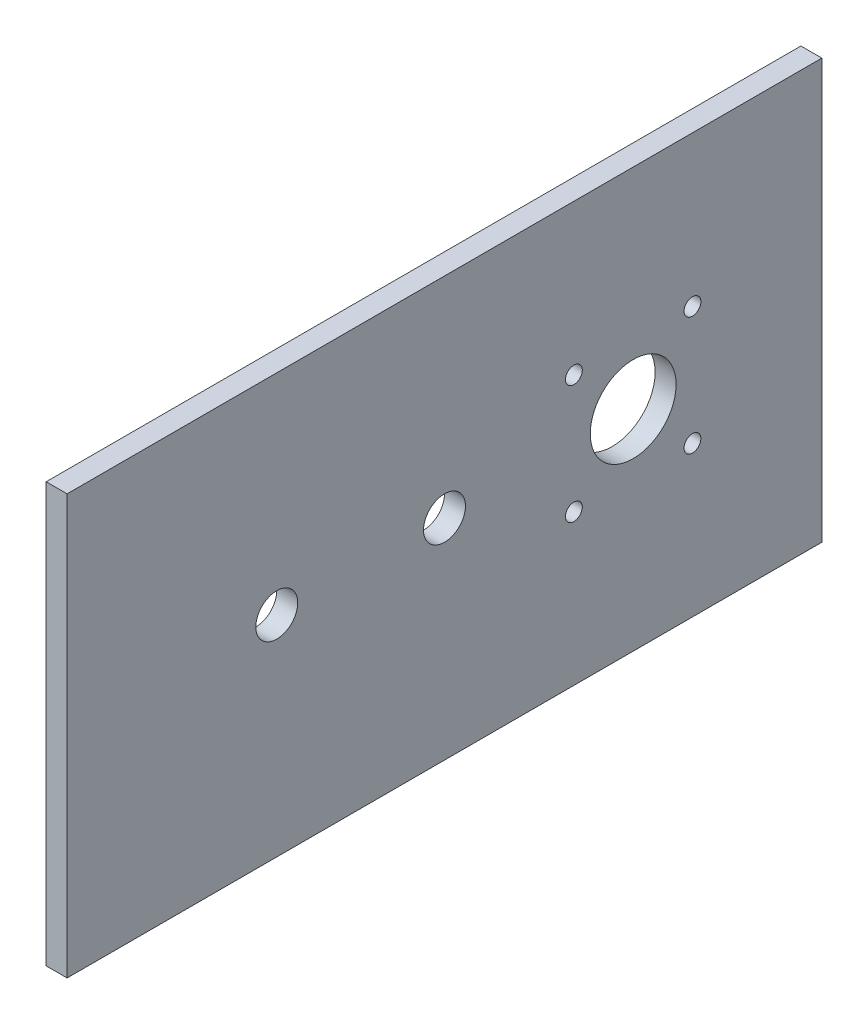
ISO-10303-21;
HEADER;
FILE_DESCRIPTION(('STEP AP214'),'2;1');
FILE_NAME('part.step','',(''),(''),'','','');
FILE_SCHEMA(('AUTOMOTIVE_DESIGN { 1 0 10303 214 1 1 1 1 }'));
ENDSEC;
DATA;
#1=APPLICATION_CONTEXT('core data for automotive mechanical design processes');
#2=APPLICATION_PROTOCOL_DEFINITION('international standard','automotive_design',2000,#1);
#3=PRODUCT_CONTEXT('',#1,'mechanical');
#4=PRODUCT('Part','Part','',(#3));
#5=PRODUCT_RELATED_PRODUCT_CATEGORY('part','',(#4));
#6=PRODUCT_DEFINITION_FORMATION('','',#4);
#7=PRODUCT_DEFINITION_CONTEXT('part definition',#1,'design');
#8=PRODUCT_DEFINITION('design','',#6,#7);
#9=PRODUCT_DEFINITION_SHAPE('','',#8);
#10=(LENGTH_UNIT() NAMED_UNIT(*) SI_UNIT(.MILLI.,.METRE.));
#11=(NAMED_UNIT(*) PLANE_ANGLE_UNIT() SI_UNIT($,.RADIAN.));
#12=(NAMED_UNIT(*) SI_UNIT($,.STERADIAN.) SOLID_ANGLE_UNIT());
#13=UNCERTAINTY_MEASURE_WITH_UNIT(LENGTH_MEASURE(1.E-05),#10,'distance_accuracy_value','');
#14=(GEOMETRIC_REPRESENTATION_CONTEXT(3) GLOBAL_UNCERTAINTY_ASSIGNED_CONTEXT((#13)) GLOBAL_UNIT_ASSIGNED_CONTEXT((#10,
#11,#12)) REPRESENTATION_CONTEXT('',''));
#15=CARTESIAN_POINT('',(0.,0.,0.));
#16=DIRECTION('',(0.,0.,1.));
#17=DIRECTION('',(1.,0.,0.));
#18=AXIS2_PLACEMENT_3D('',#15,#16,#17);
#19=CARTESIAN_POINT('',(6.35,0.,0.));
#20=DIRECTION('',(1.,0.,0.));
#21=DIRECTION('',(0.,0.,-1.));
#22=AXIS2_PLACEMENT_3D('',#19,#20,#21);
#23=PLANE('',#22);
#24=CARTESIAN_POINT('',(6.35,-17.9605122421383,-39.1894877578617));
#25=DIRECTION('',(1.,0.,0.));
#26=DIRECTION('',(0.,0.,-1.));
#27=AXIS2_PLACEMENT_3D('',#24,#25,#26);
#28=CIRCLE('',#27,2.5527);
#29=CARTESIAN_POINT('',(6.35,-17.9605122421383,-41.7421877578617));
#30=VERTEX_POINT('',#29);
#31=EDGE_CURVE('E166',#30,#30,#28,.T.);
#32=ORIENTED_EDGE('',*,*,#31,.F.);
#33=EDGE_LOOP('',(#32));
#34=FACE_BOUND('',#33,.T.);
#35=CARTESIAN_POINT('',(6.35,17.9605122421383,-75.1105122421383));
#36=DIRECTION('',(1.,0.,0.));
#37=DIRECTION('',(0.,0.,-1.));
#38=AXIS2_PLACEMENT_3D('',#35,#36,#37);
#39=CIRCLE('',#38,2.55270000000001);
#40=CARTESIAN_POINT('',(6.35,17.9605122421383,-77.6632122421383));
#41=VERTEX_POINT('',#40);
#42=EDGE_CURVE('E150',#41,#41,#39,.T.);
#43=ORIENTED_EDGE('',*,*,#42,.F.);
#44=EDGE_LOOP('',(#43));
#45=FACE_BOUND('',#44,.T.);
#46=CARTESIAN_POINT('',(6.35,0.,-57.15));
#47=DIRECTION('',(1.,0.,0.));
#48=DIRECTION('',(0.,0.,-1.));
#49=AXIS2_PLACEMENT_3D('',#46,#47,#48);
#50=CIRCLE('',#49,13.000000035);
#51=CARTESIAN_POINT('',(6.35,0.,-70.150000035));
#52=VERTEX_POINT('',#51);
#53=EDGE_CURVE('E134',#52,#52,#50,.T.);
#54=ORIENTED_EDGE('',*,*,#53,.F.);
#55=EDGE_LOOP('',(#54));
#56=FACE_BOUND('',#55,.T.);
#57=DIRECTION('',(0.,-1.,0.));
#58=VECTOR('',#57,1.);
#59=CARTESIAN_POINT('',(6.35,-63.5,114.3));
#60=LINE('',#59,#58);
#61=CARTESIAN_POINT('',(6.35,63.5,114.3));
#62=VERTEX_POINT('',#61);
#63=CARTESIAN_POINT('',(6.35,-63.5,114.3));
#64=VERTEX_POINT('',#63);
#65=EDGE_CURVE('E92',#62,#64,#60,.T.);
#66=ORIENTED_EDGE('',*,*,#65,.T.);
#67=DIRECTION('',(0.,0.,-1.));
#68=VECTOR('',#67,1.);
#69=CARTESIAN_POINT('',(6.35,-63.5,-114.3));
#70=LINE('',#69,#68);
#71=CARTESIAN_POINT('',(6.35,-63.5,-114.3));
#72=VERTEX_POINT('',#71);
#73=EDGE_CURVE('E87',#64,#72,#70,.T.);
#74=ORIENTED_EDGE('',*,*,#73,.T.);
#75=DIRECTION('',(0.,1.,0.));
#76=VECTOR('',#75,1.);
#77=CARTESIAN_POINT('',(6.35,-63.5,-114.3));
#78=LINE('',#77,#76);
#79=CARTESIAN_POINT('',(6.35,63.5,-114.3));
#80=VERTEX_POINT('',#79);
#81=EDGE_CURVE('E90',#72,#80,#78,.T.);
#82=ORIENTED_EDGE('',*,*,#81,.T.);
#83=DIRECTION('',(0.,0.,1.));
#84=VECTOR('',#83,1.);
#85=CARTESIAN_POINT('',(6.35,63.5,-114.3));
#86=LINE('',#85,#84);
#87=EDGE_CURVE('E57',#80,#62,#86,.T.);
#88=ORIENTED_EDGE('',*,*,#87,.T.);
#89=EDGE_LOOP('',(#66,#74,#82,#88));
#90=FACE_BOUND('',#89,.T.);
#91=CARTESIAN_POINT('',(6.35,0.,50.8));
#92=DIRECTION('',(1.,0.,0.));
#93=DIRECTION('',(0.,0.,-1.));
#94=AXIS2_PLACEMENT_3D('',#91,#92,#93);
#95=CIRCLE('',#94,6.35);
#96=CARTESIAN_POINT('',(6.35,0.,44.45));
#97=VERTEX_POINT('',#96);
#98=EDGE_CURVE('E112',#97,#97,#95,.T.);
#99=ORIENTED_EDGE('',*,*,#98,.F.);
#100=EDGE_LOOP('',(#99));
#101=FACE_BOUND('',#100,.T.);
#102=CARTESIAN_POINT('',(6.35,0.,0.));
#103=DIRECTION('',(1.,0.,0.));
#104=DIRECTION('',(0.,0.,-1.));
#105=AXIS2_PLACEMENT_3D('',#102,#103,#104);
#106=CIRCLE('',#105,6.35);
#107=CARTESIAN_POINT('',(6.35,0.,-6.35));
#108=VERTEX_POINT('',#107);
#109=EDGE_CURVE('E142',#108,#108,#106,.T.);
#110=ORIENTED_EDGE('',*,*,#109,.F.);
#111=EDGE_LOOP('',(#110));
#112=FACE_BOUND('',#111,.T.);
#113=CARTESIAN_POINT('',(6.35,-17.9605122421383,-75.1105122421383));
#114=DIRECTION('',(1.,0.,0.));
#115=DIRECTION('',(0.,0.,-1.));
#116=AXIS2_PLACEMENT_3D('',#113,#114,#115);
#117=CIRCLE('',#116,2.55270000000001);
#118=CARTESIAN_POINT('',(6.35,-17.9605122421383,-77.6632122421383));
#119=VERTEX_POINT('',#118);
#120=EDGE_CURVE('E158',#119,#119,#117,.T.);
#121=ORIENTED_EDGE('',*,*,#120,.F.);
#122=EDGE_LOOP('',(#121));
#123=FACE_BOUND('',#122,.T.);
#124=CARTESIAN_POINT('',(6.35,17.9605122421383,-39.1894877578617));
#125=DIRECTION('',(1.,0.,0.));
#126=DIRECTION('',(0.,0.,-1.));
#127=AXIS2_PLACEMENT_3D('',#124,#125,#126);
#128=CIRCLE('',#127,2.55269999999999);
#129=CARTESIAN_POINT('',(6.35,17.9605122421383,-41.7421877578617));
#130=VERTEX_POINT('',#129);
#131=EDGE_CURVE('E174',#130,#130,#128,.T.);
#132=ORIENTED_EDGE('',*,*,#131,.F.);
#133=EDGE_LOOP('',(#132));
#134=FACE_BOUND('',#133,.T.);
#135=ADVANCED_FACE('F39',(#34,#45,#56,#90,#101,#112,#123,#134),#23,.T.);
#136=CARTESIAN_POINT('',(0.,0.,0.));
#137=DIRECTION('',(1.,0.,0.));
#138=DIRECTION('',(0.,0.,-1.));
#139=AXIS2_PLACEMENT_3D('',#136,#137,#138);
#140=PLANE('',#139);
#141=DIRECTION('',(0.,-1.,0.));
#142=VECTOR('',#141,1.);
#143=CARTESIAN_POINT('',(0.,-63.5,114.3));
#144=LINE('',#143,#142);
#145=CARTESIAN_POINT('',(0.,63.5,114.3));
#146=VERTEX_POINT('',#145);
#147=CARTESIAN_POINT('',(0.,-63.5,114.3));
#148=VERTEX_POINT('',#147);
#149=EDGE_CURVE('E108',#146,#148,#144,.T.);
#150=ORIENTED_EDGE('',*,*,#149,.F.);
#151=DIRECTION('',(0.,0.,1.));
#152=VECTOR('',#151,1.);
#153=CARTESIAN_POINT('',(0.,63.5,-114.3));
#154=LINE('',#153,#152);
#155=CARTESIAN_POINT('',(0.,63.5,-114.3));
#156=VERTEX_POINT('',#155);
#157=EDGE_CURVE('E80',#156,#146,#154,.T.);
#158=ORIENTED_EDGE('',*,*,#157,.F.);
#159=DIRECTION('',(0.,1.,0.));
#160=VECTOR('',#159,1.);
#161=CARTESIAN_POINT('',(0.,-63.5,-114.3));
#162=LINE('',#161,#160);
#163=CARTESIAN_POINT('',(0.,-63.5,-114.3));
#164=VERTEX_POINT('',#163);
#165=EDGE_CURVE('E74',#164,#156,#162,.T.);
#166=ORIENTED_EDGE('',*,*,#165,.F.);
#167=DIRECTION('',(0.,0.,-1.));
#168=VECTOR('',#167,1.);
#169=CARTESIAN_POINT('',(0.,-63.5,-114.3));
#170=LINE('',#169,#168);
#171=EDGE_CURVE('E97',#148,#164,#170,.T.);
#172=ORIENTED_EDGE('',*,*,#171,.F.);
#173=EDGE_LOOP('',(#150,#158,#166,#172));
#174=FACE_BOUND('',#173,.T.);
#175=CARTESIAN_POINT('',(0.,0.,50.8));
#176=DIRECTION('',(1.,0.,0.));
#177=DIRECTION('',(0.,0.,-1.));
#178=AXIS2_PLACEMENT_3D('',#175,#176,#177);
#179=CIRCLE('',#178,6.35);
#180=CARTESIAN_POINT('',(0.,0.,44.45));
#181=VERTEX_POINT('',#180);
#182=EDGE_CURVE('E130',#181,#181,#179,.T.);
#183=ORIENTED_EDGE('',*,*,#182,.T.);
#184=EDGE_LOOP('',(#183));
#185=FACE_BOUND('',#184,.T.);
#186=CARTESIAN_POINT('',(0.,0.,-57.15));
#187=DIRECTION('',(1.,0.,0.));
#188=DIRECTION('',(0.,0.,-1.));
#189=AXIS2_PLACEMENT_3D('',#186,#187,#188);
#190=CIRCLE('',#189,13.000000035);
#191=CARTESIAN_POINT('',(0.,0.,-70.150000035));
#192=VERTEX_POINT('',#191);
#193=EDGE_CURVE('E138',#192,#192,#190,.T.);
#194=ORIENTED_EDGE('',*,*,#193,.T.);
#195=EDGE_LOOP('',(#194));
#196=FACE_BOUND('',#195,.T.);
#197=CARTESIAN_POINT('',(0.,0.,0.));
#198=DIRECTION('',(1.,0.,0.));
#199=DIRECTION('',(0.,0.,-1.));
#200=AXIS2_PLACEMENT_3D('',#197,#198,#199);
#201=CIRCLE('',#200,6.35);
#202=CARTESIAN_POINT('',(0.,0.,-6.35));
#203=VERTEX_POINT('',#202);
#204=EDGE_CURVE('E146',#203,#203,#201,.T.);
#205=ORIENTED_EDGE('',*,*,#204,.T.);
#206=EDGE_LOOP('',(#205));
#207=FACE_BOUND('',#206,.T.);
#208=CARTESIAN_POINT('',(0.,17.9605122421383,-75.1105122421383));
#209=DIRECTION('',(1.,0.,0.));
#210=DIRECTION('',(0.,0.,-1.));
#211=AXIS2_PLACEMENT_3D('',#208,#209,#210);
#212=CIRCLE('',#211,2.55270000000001);
#213=CARTESIAN_POINT('',(0.,17.9605122421383,-77.6632122421383));
#214=VERTEX_POINT('',#213);
#215=EDGE_CURVE('E154',#214,#214,#212,.T.);
#216=ORIENTED_EDGE('',*,*,#215,.T.);
#217=EDGE_LOOP('',(#216));
#218=FACE_BOUND('',#217,.T.);
#219=CARTESIAN_POINT('',(0.,-17.9605122421383,-75.1105122421383));
#220=DIRECTION('',(1.,0.,0.));
#221=DIRECTION('',(0.,0.,-1.));
#222=AXIS2_PLACEMENT_3D('',#219,#220,#221);
#223=CIRCLE('',#222,2.55270000000001);
#224=CARTESIAN_POINT('',(0.,-17.9605122421383,-77.6632122421383));
#225=VERTEX_POINT('',#224);
#226=EDGE_CURVE('E162',#225,#225,#223,.T.);
#227=ORIENTED_EDGE('',*,*,#226,.T.);
#228=EDGE_LOOP('',(#227));
#229=FACE_BOUND('',#228,.T.);
#230=CARTESIAN_POINT('',(0.,-17.9605122421383,-39.1894877578617));
#231=DIRECTION('',(1.,0.,0.));
#232=DIRECTION('',(0.,0.,-1.));
#233=AXIS2_PLACEMENT_3D('',#230,#231,#232);
#234=CIRCLE('',#233,2.5527);
#235=CARTESIAN_POINT('',(0.,-17.9605122421383,-41.7421877578617));
#236=VERTEX_POINT('',#235);
#237=EDGE_CURVE('E170',#236,#236,#234,.T.);
#238=ORIENTED_EDGE('',*,*,#237,.T.);
#239=EDGE_LOOP('',(#238));
#240=FACE_BOUND('',#239,.T.);
#241=CARTESIAN_POINT('',(0.,17.9605122421383,-39.1894877578617));
#242=DIRECTION('',(1.,0.,0.));
#243=DIRECTION('',(0.,0.,-1.));
#244=AXIS2_PLACEMENT_3D('',#241,#242,#243);
#245=CIRCLE('',#244,2.55269999999999);
#246=CARTESIAN_POINT('',(0.,17.9605122421383,-41.7421877578617));
#247=VERTEX_POINT('',#246);
#248=EDGE_CURVE('E178',#247,#247,#245,.T.);
#249=ORIENTED_EDGE('',*,*,#248,.T.);
#250=EDGE_LOOP('',(#249));
#251=FACE_BOUND('',#250,.T.);
#252=ADVANCED_FACE('F125',(#174,#185,#196,#207,#218,#229,#240,#251),#140,.F.);
#253=CARTESIAN_POINT('',(6.35,-63.5,114.3));
#254=DIRECTION('',(0.,0.,-1.));
#255=DIRECTION('',(-1.,0.,0.));
#256=AXIS2_PLACEMENT_3D('',#253,#254,#255);
#257=PLANE('',#256);
#258=ORIENTED_EDGE('',*,*,#149,.T.);
#259=DIRECTION('',(-1.,0.,0.));
#260=VECTOR('',#259,1.);
#261=CARTESIAN_POINT('',(6.35,-63.5,114.3));
#262=LINE('',#261,#260);
#263=EDGE_CURVE('E11',#64,#148,#262,.T.);
#264=ORIENTED_EDGE('',*,*,#263,.F.);
#265=ORIENTED_EDGE('',*,*,#65,.F.);
#266=DIRECTION('',(-1.,0.,0.));
#267=VECTOR('',#266,1.);
#268=CARTESIAN_POINT('',(6.35,63.5,114.3));
#269=LINE('',#268,#267);
#270=EDGE_CURVE('E104',#62,#146,#269,.T.);
#271=ORIENTED_EDGE('',*,*,#270,.T.);
#272=EDGE_LOOP('',(#258,#264,#265,#271));
#273=FACE_BOUND('',#272,.T.);
#274=ADVANCED_FACE('F41',(#273),#257,.F.);
#275=CARTESIAN_POINT('',(6.35,-63.5,-114.3));
#276=DIRECTION('',(0.,1.,0.));
#277=DIRECTION('',(0.,0.,1.));
#278=AXIS2_PLACEMENT_3D('',#275,#276,#277);
#279=PLANE('',#278);
#280=ORIENTED_EDGE('',*,*,#171,.T.);
#281=DIRECTION('',(-1.,0.,0.));
#282=VECTOR('',#281,1.);
#283=CARTESIAN_POINT('',(6.35,-63.5,-114.3));
#284=LINE('',#283,#282);
#285=EDGE_CURVE('E49',#72,#164,#284,.T.);
#286=ORIENTED_EDGE('',*,*,#285,.F.);
#287=ORIENTED_EDGE('',*,*,#73,.F.);
#288=ORIENTED_EDGE('',*,*,#263,.T.);
#289=EDGE_LOOP('',(#280,#286,#287,#288));
#290=FACE_BOUND('',#289,.T.);
#291=ADVANCED_FACE('F96',(#290),#279,.F.);
#292=CARTESIAN_POINT('',(6.35,-63.5,-114.3));
#293=DIRECTION('',(0.,0.,1.));
#294=DIRECTION('',(1.,0.,0.));
#295=AXIS2_PLACEMENT_3D('',#292,#293,#294);
#296=PLANE('',#295);
#297=ORIENTED_EDGE('',*,*,#165,.T.);
#298=DIRECTION('',(-1.,0.,0.));
#299=VECTOR('',#298,1.);
#300=CARTESIAN_POINT('',(6.35,63.5,-114.3));
#301=LINE('',#300,#299);
#302=EDGE_CURVE('E99',#80,#156,#301,.T.);
#303=ORIENTED_EDGE('',*,*,#302,.F.);
#304=ORIENTED_EDGE('',*,*,#81,.F.);
#305=ORIENTED_EDGE('',*,*,#285,.T.);
#306=EDGE_LOOP('',(#297,#303,#304,#305));
#307=FACE_BOUND('',#306,.T.);
#308=ADVANCED_FACE('F100',(#307),#296,.F.);
#309=CARTESIAN_POINT('',(6.35,63.5,-114.3));
#310=DIRECTION('',(0.,-1.,0.));
#311=DIRECTION('',(0.,0.,-1.));
#312=AXIS2_PLACEMENT_3D('',#309,#310,#311);
#313=PLANE('',#312);
#314=ORIENTED_EDGE('',*,*,#157,.T.);
#315=ORIENTED_EDGE('',*,*,#270,.F.);
#316=ORIENTED_EDGE('',*,*,#87,.F.);
#317=ORIENTED_EDGE('',*,*,#302,.T.);
#318=EDGE_LOOP('',(#314,#315,#316,#317));
#319=FACE_BOUND('',#318,.T.);
#320=ADVANCED_FACE('F122',(#319),#313,.F.);
#321=CARTESIAN_POINT('',(6.35,0.,50.8));
#322=DIRECTION('',(-1.,0.,0.));
#323=DIRECTION('',(0.,0.,1.));
#324=AXIS2_PLACEMENT_3D('',#321,#322,#323);
#325=CYLINDRICAL_SURFACE('',#324,6.35);
#326=ORIENTED_EDGE('',*,*,#98,.T.);
#327=EDGE_LOOP('',(#326));
#328=FACE_BOUND('',#327,.T.);
#329=ORIENTED_EDGE('',*,*,#182,.F.);
#330=EDGE_LOOP('',(#329));
#331=FACE_BOUND('',#330,.T.);
#332=ADVANCED_FACE('F199',(#328,#331),#325,.F.);
#333=CARTESIAN_POINT('',(6.35,0.,-57.15));
#334=DIRECTION('',(-1.,0.,0.));
#335=DIRECTION('',(0.,0.,1.));
#336=AXIS2_PLACEMENT_3D('',#333,#334,#335);
#337=CYLINDRICAL_SURFACE('',#336,13.000000035);
#338=ORIENTED_EDGE('',*,*,#53,.T.);
#339=EDGE_LOOP('',(#338));
#340=FACE_BOUND('',#339,.T.);
#341=ORIENTED_EDGE('',*,*,#193,.F.);
#342=EDGE_LOOP('',(#341));
#343=FACE_BOUND('',#342,.T.);
#344=ADVANCED_FACE('F245',(#340,#343),#337,.F.);
#345=CARTESIAN_POINT('',(6.35,0.,0.));
#346=DIRECTION('',(-1.,0.,0.));
#347=DIRECTION('',(0.,0.,1.));
#348=AXIS2_PLACEMENT_3D('',#345,#346,#347);
#349=CYLINDRICAL_SURFACE('',#348,6.35);
#350=ORIENTED_EDGE('',*,*,#109,.T.);
#351=EDGE_LOOP('',(#350));
#352=FACE_BOUND('',#351,.T.);
#353=ORIENTED_EDGE('',*,*,#204,.F.);
#354=EDGE_LOOP('',(#353));
#355=FACE_BOUND('',#354,.T.);
#356=ADVANCED_FACE('F253',(#352,#355),#349,.F.);
#357=CARTESIAN_POINT('',(6.35,17.9605122421383,-75.1105122421383));
#358=DIRECTION('',(-1.,0.,0.));
#359=DIRECTION('',(0.,0.,1.));
#360=AXIS2_PLACEMENT_3D('',#357,#358,#359);
#361=CYLINDRICAL_SURFACE('',#360,2.55270000000001);
#362=ORIENTED_EDGE('',*,*,#42,.T.);
#363=EDGE_LOOP('',(#362));
#364=FACE_BOUND('',#363,.T.);
#365=ORIENTED_EDGE('',*,*,#215,.F.);
#366=EDGE_LOOP('',(#365));
#367=FACE_BOUND('',#366,.T.);
#368=ADVANCED_FACE('F261',(#364,#367),#361,.F.);
#369=CARTESIAN_POINT('',(6.35,-17.9605122421383,-75.1105122421383));
#370=DIRECTION('',(-1.,0.,0.));
#371=DIRECTION('',(0.,0.,1.));
#372=AXIS2_PLACEMENT_3D('',#369,#370,#371);
#373=CYLINDRICAL_SURFACE('',#372,2.55270000000001);
#374=ORIENTED_EDGE('',*,*,#120,.T.);
#375=EDGE_LOOP('',(#374));
#376=FACE_BOUND('',#375,.T.);
#377=ORIENTED_EDGE('',*,*,#226,.F.);
#378=EDGE_LOOP('',(#377));
#379=FACE_BOUND('',#378,.T.);
#380=ADVANCED_FACE('F270',(#376,#379),#373,.F.);
#381=CARTESIAN_POINT('',(6.35,-17.9605122421383,-39.1894877578617));
#382=DIRECTION('',(-1.,0.,0.));
#383=DIRECTION('',(0.,0.,1.));
#384=AXIS2_PLACEMENT_3D('',#381,#382,#383);
#385=CYLINDRICAL_SURFACE('',#384,2.5527);
#386=ORIENTED_EDGE('',*,*,#31,.T.);
#387=EDGE_LOOP('',(#386));
#388=FACE_BOUND('',#387,.T.);
#389=ORIENTED_EDGE('',*,*,#237,.F.);
#390=EDGE_LOOP('',(#389));
#391=FACE_BOUND('',#390,.T.);
#392=ADVANCED_FACE('F279',(#388,#391),#385,.F.);
#393=CARTESIAN_POINT('',(6.35,17.9605122421383,-39.1894877578617));
#394=DIRECTION('',(-1.,0.,0.));
#395=DIRECTION('',(0.,0.,1.));
#396=AXIS2_PLACEMENT_3D('',#393,#394,#395);
#397=CYLINDRICAL_SURFACE('',#396,2.55269999999999);
#398=ORIENTED_EDGE('',*,*,#131,.T.);
#399=EDGE_LOOP('',(#398));
#400=FACE_BOUND('',#399,.T.);
#401=ORIENTED_EDGE('',*,*,#248,.F.);
#402=EDGE_LOOP('',(#401));
#403=FACE_BOUND('',#402,.T.);
#404=ADVANCED_FACE('F186',(#400,#403),#397,.F.);
#405=CLOSED_SHELL('',(#135,#252,#274,#291,#308,#320,#332,#344,#356,#368,#380,#392,#404));
#406=MANIFOLD_SOLID_BREP('B2',#405);
#407=ADVANCED_BREP_SHAPE_REPRESENTATION('',(#18,#406),#14);
#408=SHAPE_DEFINITION_REPRESENTATION(#9,#407);
ENDSEC;
END-ISO-10303-21;
